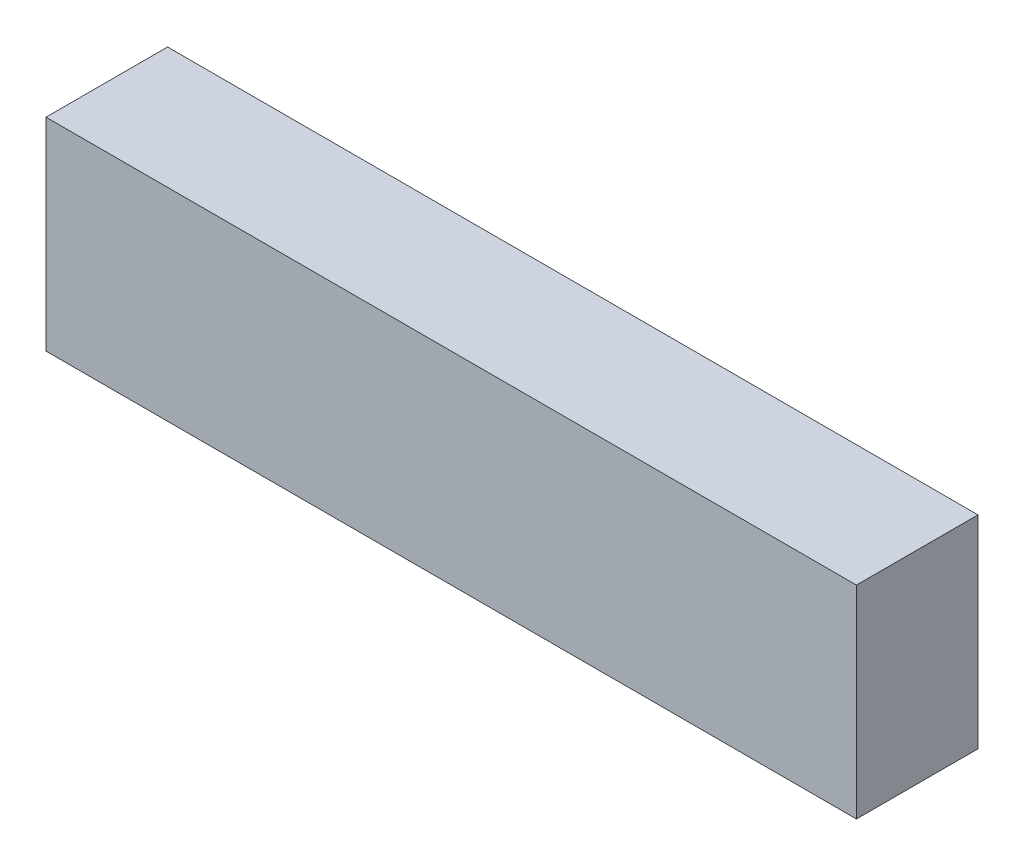
ISO-10303-21;
HEADER;
FILE_DESCRIPTION(('STEP AP214'),'2;1');
FILE_NAME('part.step','',(''),(''),'','','');
FILE_SCHEMA(('AUTOMOTIVE_DESIGN { 1 0 10303 214 1 1 1 1 }'));
ENDSEC;
DATA;
#1=APPLICATION_CONTEXT('core data for automotive mechanical design processes');
#2=APPLICATION_PROTOCOL_DEFINITION('international standard','automotive_design',2000,#1);
#3=PRODUCT_CONTEXT('',#1,'mechanical');
#4=PRODUCT('Part','Part','',(#3));
#5=PRODUCT_RELATED_PRODUCT_CATEGORY('part','',(#4));
#6=PRODUCT_DEFINITION_FORMATION('','',#4);
#7=PRODUCT_DEFINITION_CONTEXT('part definition',#1,'design');
#8=PRODUCT_DEFINITION('design','',#6,#7);
#9=PRODUCT_DEFINITION_SHAPE('','',#8);
#10=(LENGTH_UNIT() NAMED_UNIT(*) SI_UNIT(.MILLI.,.METRE.));
#11=(NAMED_UNIT(*) PLANE_ANGLE_UNIT() SI_UNIT($,.RADIAN.));
#12=(NAMED_UNIT(*) SI_UNIT($,.STERADIAN.) SOLID_ANGLE_UNIT());
#13=UNCERTAINTY_MEASURE_WITH_UNIT(LENGTH_MEASURE(1.E-05),#10,'distance_accuracy_value','');
#14=(GEOMETRIC_REPRESENTATION_CONTEXT(3) GLOBAL_UNCERTAINTY_ASSIGNED_CONTEXT((#13)) GLOBAL_UNIT_ASSIGNED_CONTEXT((#10,
#11,#12)) REPRESENTATION_CONTEXT('',''));
#15=CARTESIAN_POINT('',(0.,0.,0.));
#16=DIRECTION('',(0.,0.,1.));
#17=DIRECTION('',(1.,0.,0.));
#18=AXIS2_PLACEMENT_3D('',#15,#16,#17);
#19=CARTESIAN_POINT('',(10.,2.5,3.));
#20=DIRECTION('',(-1.,0.,0.));
#21=DIRECTION('',(0.,0.,1.));
#22=AXIS2_PLACEMENT_3D('',#19,#20,#21);
#23=PLANE('',#22);
#24=DIRECTION('',(0.,1.,0.));
#25=VECTOR('',#24,1.);
#26=CARTESIAN_POINT('',(10.,2.5,0.));
#27=LINE('',#26,#25);
#28=CARTESIAN_POINT('',(10.,-2.5,0.));
#29=VERTEX_POINT('',#28);
#30=CARTESIAN_POINT('',(10.,2.5,0.));
#31=VERTEX_POINT('',#30);
#32=EDGE_CURVE('E96',#29,#31,#27,.T.);
#33=ORIENTED_EDGE('',*,*,#32,.T.);
#34=DIRECTION('',(0.,0.,-1.));
#35=VECTOR('',#34,1.);
#36=CARTESIAN_POINT('',(10.,2.5,3.));
#37=LINE('',#36,#35);
#38=CARTESIAN_POINT('',(10.,2.5,3.));
#39=VERTEX_POINT('',#38);
#40=EDGE_CURVE('E11',#39,#31,#37,.T.);
#41=ORIENTED_EDGE('',*,*,#40,.F.);
#42=DIRECTION('',(0.,1.,0.));
#43=VECTOR('',#42,1.);
#44=CARTESIAN_POINT('',(10.,2.5,3.));
#45=LINE('',#44,#43);
#46=CARTESIAN_POINT('',(10.,-2.5,3.));
#47=VERTEX_POINT('',#46);
#48=EDGE_CURVE('E84',#47,#39,#45,.T.);
#49=ORIENTED_EDGE('',*,*,#48,.F.);
#50=DIRECTION('',(0.,0.,-1.));
#51=VECTOR('',#50,1.);
#52=CARTESIAN_POINT('',(10.,-2.5,3.));
#53=LINE('',#52,#51);
#54=EDGE_CURVE('E92',#47,#29,#53,.T.);
#55=ORIENTED_EDGE('',*,*,#54,.T.);
#56=EDGE_LOOP('',(#33,#41,#49,#55));
#57=FACE_BOUND('',#56,.T.);
#58=ADVANCED_FACE('F33',(#57),#23,.F.);
#59=CARTESIAN_POINT('',(-10.,2.5,3.));
#60=DIRECTION('',(0.,-1.,0.));
#61=DIRECTION('',(0.,0.,-1.));
#62=AXIS2_PLACEMENT_3D('',#59,#60,#61);
#63=PLANE('',#62);
#64=DIRECTION('',(-1.,0.,0.));
#65=VECTOR('',#64,1.);
#66=CARTESIAN_POINT('',(-10.,2.5,0.));
#67=LINE('',#66,#65);
#68=CARTESIAN_POINT('',(-10.,2.5,0.));
#69=VERTEX_POINT('',#68);
#70=EDGE_CURVE('E88',#31,#69,#67,.T.);
#71=ORIENTED_EDGE('',*,*,#70,.T.);
#72=DIRECTION('',(0.,0.,-1.));
#73=VECTOR('',#72,1.);
#74=CARTESIAN_POINT('',(-10.,2.5,3.));
#75=LINE('',#74,#73);
#76=CARTESIAN_POINT('',(-10.,2.5,3.));
#77=VERTEX_POINT('',#76);
#78=EDGE_CURVE('E41',#77,#69,#75,.T.);
#79=ORIENTED_EDGE('',*,*,#78,.F.);
#80=DIRECTION('',(-1.,0.,0.));
#81=VECTOR('',#80,1.);
#82=CARTESIAN_POINT('',(-10.,2.5,3.));
#83=LINE('',#82,#81);
#84=EDGE_CURVE('E79',#39,#77,#83,.T.);
#85=ORIENTED_EDGE('',*,*,#84,.F.);
#86=ORIENTED_EDGE('',*,*,#40,.T.);
#87=EDGE_LOOP('',(#71,#79,#85,#86));
#88=FACE_BOUND('',#87,.T.);
#89=ADVANCED_FACE('F87',(#88),#63,.F.);
#90=CARTESIAN_POINT('',(-10.,2.5,3.));
#91=DIRECTION('',(1.,0.,0.));
#92=DIRECTION('',(0.,0.,-1.));
#93=AXIS2_PLACEMENT_3D('',#90,#91,#92);
#94=PLANE('',#93);
#95=DIRECTION('',(0.,-1.,0.));
#96=VECTOR('',#95,1.);
#97=CARTESIAN_POINT('',(-10.,2.5,0.));
#98=LINE('',#97,#96);
#99=CARTESIAN_POINT('',(-10.,-2.5,0.));
#100=VERTEX_POINT('',#99);
#101=EDGE_CURVE('E66',#69,#100,#98,.T.);
#102=ORIENTED_EDGE('',*,*,#101,.T.);
#103=DIRECTION('',(0.,0.,-1.));
#104=VECTOR('',#103,1.);
#105=CARTESIAN_POINT('',(-10.,-2.5,3.));
#106=LINE('',#105,#104);
#107=CARTESIAN_POINT('',(-10.,-2.5,3.));
#108=VERTEX_POINT('',#107);
#109=EDGE_CURVE('E89',#108,#100,#106,.T.);
#110=ORIENTED_EDGE('',*,*,#109,.F.);
#111=DIRECTION('',(0.,-1.,0.));
#112=VECTOR('',#111,1.);
#113=CARTESIAN_POINT('',(-10.,2.5,3.));
#114=LINE('',#113,#112);
#115=EDGE_CURVE('E82',#77,#108,#114,.T.);
#116=ORIENTED_EDGE('',*,*,#115,.F.);
#117=ORIENTED_EDGE('',*,*,#78,.T.);
#118=EDGE_LOOP('',(#102,#110,#116,#117));
#119=FACE_BOUND('',#118,.T.);
#120=ADVANCED_FACE('F90',(#119),#94,.F.);
#121=CARTESIAN_POINT('',(-10.,-2.5,3.));
#122=DIRECTION('',(0.,1.,0.));
#123=DIRECTION('',(0.,0.,1.));
#124=AXIS2_PLACEMENT_3D('',#121,#122,#123);
#125=PLANE('',#124);
#126=DIRECTION('',(1.,0.,0.));
#127=VECTOR('',#126,1.);
#128=CARTESIAN_POINT('',(-10.,-2.5,0.));
#129=LINE('',#128,#127);
#130=EDGE_CURVE('E72',#100,#29,#129,.T.);
#131=ORIENTED_EDGE('',*,*,#130,.T.);
#132=ORIENTED_EDGE('',*,*,#54,.F.);
#133=DIRECTION('',(1.,0.,0.));
#134=VECTOR('',#133,1.);
#135=CARTESIAN_POINT('',(-10.,-2.5,3.));
#136=LINE('',#135,#134);
#137=EDGE_CURVE('E49',#108,#47,#136,.T.);
#138=ORIENTED_EDGE('',*,*,#137,.F.);
#139=ORIENTED_EDGE('',*,*,#109,.T.);
#140=EDGE_LOOP('',(#131,#132,#138,#139));
#141=FACE_BOUND('',#140,.T.);
#142=ADVANCED_FACE('F103',(#141),#125,.F.);
#143=CARTESIAN_POINT('',(0.,0.,3.));
#144=DIRECTION('',(0.,0.,1.));
#145=DIRECTION('',(1.,0.,0.));
#146=AXIS2_PLACEMENT_3D('',#143,#144,#145);
#147=PLANE('',#146);
#148=ORIENTED_EDGE('',*,*,#48,.T.);
#149=ORIENTED_EDGE('',*,*,#84,.T.);
#150=ORIENTED_EDGE('',*,*,#115,.T.);
#151=ORIENTED_EDGE('',*,*,#137,.T.);
#152=EDGE_LOOP('',(#148,#149,#150,#151));
#153=FACE_BOUND('',#152,.T.);
#154=ADVANCED_FACE('F80',(#153),#147,.T.);
#155=CARTESIAN_POINT('',(0.,0.,0.));
#156=DIRECTION('',(0.,0.,1.));
#157=DIRECTION('',(1.,0.,0.));
#158=AXIS2_PLACEMENT_3D('',#155,#156,#157);
#159=PLANE('',#158);
#160=ORIENTED_EDGE('',*,*,#32,.F.);
#161=ORIENTED_EDGE('',*,*,#130,.F.);
#162=ORIENTED_EDGE('',*,*,#101,.F.);
#163=ORIENTED_EDGE('',*,*,#70,.F.);
#164=EDGE_LOOP('',(#160,#161,#162,#163));
#165=FACE_BOUND('',#164,.T.);
#166=ADVANCED_FACE('F106',(#165),#159,.F.);
#167=CLOSED_SHELL('',(#58,#89,#120,#142,#154,#166));
#168=MANIFOLD_SOLID_BREP('B2',#167);
#169=ADVANCED_BREP_SHAPE_REPRESENTATION('',(#18,#168),#14);
#170=SHAPE_DEFINITION_REPRESENTATION(#9,#169);
ENDSEC;
END-ISO-10303-21;
